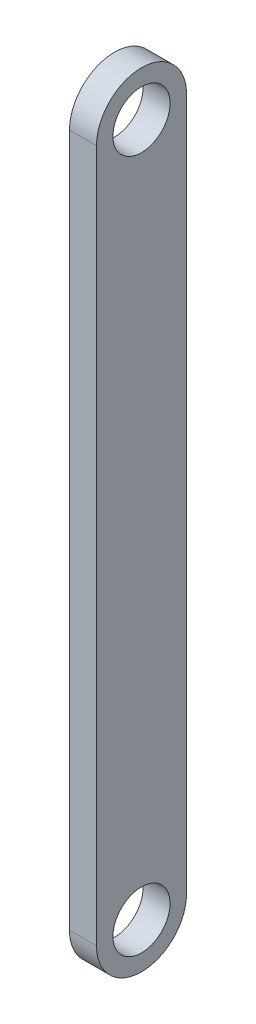
ISO-10303-21;
HEADER;
FILE_DESCRIPTION(('STEP AP214'),'2;1');
FILE_NAME('part.step','',(''),(''),'','','');
FILE_SCHEMA(('AUTOMOTIVE_DESIGN { 1 0 10303 214 1 1 1 1 }'));
ENDSEC;
DATA;
#1=APPLICATION_CONTEXT('core data for automotive mechanical design processes');
#2=APPLICATION_PROTOCOL_DEFINITION('international standard','automotive_design',2000,#1);
#3=PRODUCT_CONTEXT('',#1,'mechanical');
#4=PRODUCT('Part','Part','',(#3));
#5=PRODUCT_RELATED_PRODUCT_CATEGORY('part','',(#4));
#6=PRODUCT_DEFINITION_FORMATION('','',#4);
#7=PRODUCT_DEFINITION_CONTEXT('part definition',#1,'design');
#8=PRODUCT_DEFINITION('design','',#6,#7);
#9=PRODUCT_DEFINITION_SHAPE('','',#8);
#10=(LENGTH_UNIT() NAMED_UNIT(*) SI_UNIT(.MILLI.,.METRE.));
#11=(NAMED_UNIT(*) PLANE_ANGLE_UNIT() SI_UNIT($,.RADIAN.));
#12=(NAMED_UNIT(*) SI_UNIT($,.STERADIAN.) SOLID_ANGLE_UNIT());
#13=UNCERTAINTY_MEASURE_WITH_UNIT(LENGTH_MEASURE(1.E-05),#10,'distance_accuracy_value','');
#14=(GEOMETRIC_REPRESENTATION_CONTEXT(3) GLOBAL_UNCERTAINTY_ASSIGNED_CONTEXT((#13)) GLOBAL_UNIT_ASSIGNED_CONTEXT((#10,
#11,#12)) REPRESENTATION_CONTEXT('',''));
#15=CARTESIAN_POINT('',(0.,0.,0.));
#16=DIRECTION('',(0.,0.,1.));
#17=DIRECTION('',(1.,0.,0.));
#18=AXIS2_PLACEMENT_3D('',#15,#16,#17);
#19=CARTESIAN_POINT('',(3.,-38.5,0.));
#20=DIRECTION('',(-1.,0.,0.));
#21=DIRECTION('',(0.,0.,1.));
#22=AXIS2_PLACEMENT_3D('',#19,#20,#21);
#23=CYLINDRICAL_SURFACE('',#22,5.);
#24=DIRECTION('',(-1.,0.,0.));
#25=VECTOR('',#24,1.);
#26=CARTESIAN_POINT('',(3.,-38.5,-5.));
#27=LINE('',#26,#25);
#28=CARTESIAN_POINT('',(3.,-38.5,-5.));
#29=VERTEX_POINT('',#28);
#30=CARTESIAN_POINT('',(0.,-38.5,-5.));
#31=VERTEX_POINT('',#30);
#32=EDGE_CURVE('E90',#29,#31,#27,.T.);
#33=ORIENTED_EDGE('',*,*,#32,.F.);
#34=CARTESIAN_POINT('',(3.,-38.5,0.));
#35=DIRECTION('',(-1.,0.,0.));
#36=DIRECTION('',(0.,0.,1.));
#37=AXIS2_PLACEMENT_3D('',#34,#35,#36);
#38=CIRCLE('',#37,5.);
#39=CARTESIAN_POINT('',(3.,-38.5,5.));
#40=VERTEX_POINT('',#39);
#41=EDGE_CURVE('E44',#40,#29,#38,.F.);
#42=ORIENTED_EDGE('',*,*,#41,.F.);
#43=DIRECTION('',(1.,0.,0.));
#44=VECTOR('',#43,1.);
#45=CARTESIAN_POINT('',(3.,-38.5,5.));
#46=LINE('',#45,#44);
#47=CARTESIAN_POINT('',(0.,-38.5,5.));
#48=VERTEX_POINT('',#47);
#49=EDGE_CURVE('E107',#48,#40,#46,.T.);
#50=ORIENTED_EDGE('',*,*,#49,.F.);
#51=CARTESIAN_POINT('',(0.,-38.5,0.));
#52=DIRECTION('',(-1.,0.,0.));
#53=DIRECTION('',(0.,0.,1.));
#54=AXIS2_PLACEMENT_3D('',#51,#52,#53);
#55=CIRCLE('',#54,5.);
#56=EDGE_CURVE('E11',#31,#48,#55,.T.);
#57=ORIENTED_EDGE('',*,*,#56,.F.);
#58=EDGE_LOOP('',(#33,#42,#50,#57));
#59=FACE_BOUND('',#58,.T.);
#60=ADVANCED_FACE('F36',(#59),#23,.T.);
#61=CARTESIAN_POINT('',(3.,38.5,0.));
#62=DIRECTION('',(-1.,0.,0.));
#63=DIRECTION('',(0.,0.,1.));
#64=AXIS2_PLACEMENT_3D('',#61,#62,#63);
#65=CYLINDRICAL_SURFACE('',#64,5.);
#66=DIRECTION('',(-1.,0.,0.));
#67=VECTOR('',#66,1.);
#68=CARTESIAN_POINT('',(3.,38.5,5.));
#69=LINE('',#68,#67);
#70=CARTESIAN_POINT('',(3.,38.5,5.));
#71=VERTEX_POINT('',#70);
#72=CARTESIAN_POINT('',(0.,38.5,5.));
#73=VERTEX_POINT('',#72);
#74=EDGE_CURVE('E87',#71,#73,#69,.T.);
#75=ORIENTED_EDGE('',*,*,#74,.F.);
#76=CARTESIAN_POINT('',(3.,38.5,0.));
#77=DIRECTION('',(-1.,0.,0.));
#78=DIRECTION('',(0.,0.,1.));
#79=AXIS2_PLACEMENT_3D('',#76,#77,#78);
#80=CIRCLE('',#79,5.);
#81=CARTESIAN_POINT('',(3.,38.5,-5.));
#82=VERTEX_POINT('',#81);
#83=EDGE_CURVE('E91',#82,#71,#80,.F.);
#84=ORIENTED_EDGE('',*,*,#83,.F.);
#85=DIRECTION('',(1.,0.,0.));
#86=VECTOR('',#85,1.);
#87=CARTESIAN_POINT('',(3.,38.5,-5.));
#88=LINE('',#87,#86);
#89=CARTESIAN_POINT('',(0.,38.5,-5.));
#90=VERTEX_POINT('',#89);
#91=EDGE_CURVE('E89',#90,#82,#88,.T.);
#92=ORIENTED_EDGE('',*,*,#91,.F.);
#93=CARTESIAN_POINT('',(0.,38.5,0.));
#94=DIRECTION('',(-1.,0.,0.));
#95=DIRECTION('',(0.,0.,1.));
#96=AXIS2_PLACEMENT_3D('',#93,#94,#95);
#97=CIRCLE('',#96,5.);
#98=EDGE_CURVE('E76',#73,#90,#97,.T.);
#99=ORIENTED_EDGE('',*,*,#98,.F.);
#100=EDGE_LOOP('',(#75,#84,#92,#99));
#101=FACE_BOUND('',#100,.T.);
#102=ADVANCED_FACE('F85',(#101),#65,.T.);
#103=CARTESIAN_POINT('',(3.,-43.5,5.));
#104=DIRECTION('',(0.,0.,1.));
#105=DIRECTION('',(1.,0.,0.));
#106=AXIS2_PLACEMENT_3D('',#103,#104,#105);
#107=PLANE('',#106);
#108=DIRECTION('',(0.,1.,0.));
#109=VECTOR('',#108,1.);
#110=CARTESIAN_POINT('',(0.,-43.5,5.));
#111=LINE('',#110,#109);
#112=EDGE_CURVE('E73',#48,#73,#111,.T.);
#113=ORIENTED_EDGE('',*,*,#112,.F.);
#114=ORIENTED_EDGE('',*,*,#49,.T.);
#115=DIRECTION('',(0.,1.,0.));
#116=VECTOR('',#115,1.);
#117=CARTESIAN_POINT('',(3.,-43.5,5.));
#118=LINE('',#117,#116);
#119=EDGE_CURVE('E95',#40,#71,#118,.T.);
#120=ORIENTED_EDGE('',*,*,#119,.T.);
#121=ORIENTED_EDGE('',*,*,#74,.T.);
#122=EDGE_LOOP('',(#113,#114,#120,#121));
#123=FACE_BOUND('',#122,.T.);
#124=ADVANCED_FACE('F93',(#123),#107,.T.);
#125=CARTESIAN_POINT('',(3.,-43.5,-5.));
#126=DIRECTION('',(0.,0.,1.));
#127=DIRECTION('',(1.,0.,0.));
#128=AXIS2_PLACEMENT_3D('',#125,#126,#127);
#129=PLANE('',#128);
#130=DIRECTION('',(0.,1.,0.));
#131=VECTOR('',#130,1.);
#132=CARTESIAN_POINT('',(3.,-43.5,-5.));
#133=LINE('',#132,#131);
#134=EDGE_CURVE('E97',#29,#82,#133,.T.);
#135=ORIENTED_EDGE('',*,*,#134,.F.);
#136=ORIENTED_EDGE('',*,*,#32,.T.);
#137=DIRECTION('',(0.,1.,0.));
#138=VECTOR('',#137,1.);
#139=CARTESIAN_POINT('',(0.,-43.5,-5.));
#140=LINE('',#139,#138);
#141=EDGE_CURVE('E80',#31,#90,#140,.T.);
#142=ORIENTED_EDGE('',*,*,#141,.T.);
#143=ORIENTED_EDGE('',*,*,#91,.T.);
#144=EDGE_LOOP('',(#135,#136,#142,#143));
#145=FACE_BOUND('',#144,.T.);
#146=ADVANCED_FACE('F112',(#145),#129,.F.);
#147=CARTESIAN_POINT('',(3.,0.,0.));
#148=DIRECTION('',(-1.,0.,0.));
#149=DIRECTION('',(0.,0.,1.));
#150=AXIS2_PLACEMENT_3D('',#147,#148,#149);
#151=PLANE('',#150);
#152=CARTESIAN_POINT('',(3.,38.5,0.));
#153=DIRECTION('',(1.,0.,0.));
#154=DIRECTION('',(0.,0.,-1.));
#155=AXIS2_PLACEMENT_3D('',#152,#153,#154);
#156=CIRCLE('',#155,3.175);
#157=CARTESIAN_POINT('',(3.,38.5,-3.175));
#158=VERTEX_POINT('',#157);
#159=EDGE_CURVE('E117',#158,#158,#156,.T.);
#160=ORIENTED_EDGE('',*,*,#159,.F.);
#161=EDGE_LOOP('',(#160));
#162=FACE_BOUND('',#161,.T.);
#163=CARTESIAN_POINT('',(3.,-38.5,0.));
#164=DIRECTION('',(1.,0.,0.));
#165=DIRECTION('',(0.,0.,-1.));
#166=AXIS2_PLACEMENT_3D('',#163,#164,#165);
#167=CIRCLE('',#166,3.175);
#168=CARTESIAN_POINT('',(3.,-38.5,-3.175));
#169=VERTEX_POINT('',#168);
#170=EDGE_CURVE('E122',#169,#169,#167,.T.);
#171=ORIENTED_EDGE('',*,*,#170,.F.);
#172=EDGE_LOOP('',(#171));
#173=FACE_BOUND('',#172,.T.);
#174=ORIENTED_EDGE('',*,*,#119,.F.);
#175=ORIENTED_EDGE('',*,*,#41,.T.);
#176=ORIENTED_EDGE('',*,*,#134,.T.);
#177=ORIENTED_EDGE('',*,*,#83,.T.);
#178=EDGE_LOOP('',(#174,#175,#176,#177));
#179=FACE_BOUND('',#178,.T.);
#180=ADVANCED_FACE('F109',(#162,#173,#179),#151,.F.);
#181=CARTESIAN_POINT('',(0.,0.,0.));
#182=DIRECTION('',(-1.,0.,0.));
#183=DIRECTION('',(0.,0.,1.));
#184=AXIS2_PLACEMENT_3D('',#181,#182,#183);
#185=PLANE('',#184);
#186=CARTESIAN_POINT('',(0.,38.5,0.));
#187=DIRECTION('',(-1.,0.,0.));
#188=DIRECTION('',(0.,0.,1.));
#189=AXIS2_PLACEMENT_3D('',#186,#187,#188);
#190=CIRCLE('',#189,3.175);
#191=CARTESIAN_POINT('',(0.,38.5,3.175));
#192=VERTEX_POINT('',#191);
#193=EDGE_CURVE('E81',#192,#192,#190,.T.);
#194=ORIENTED_EDGE('',*,*,#193,.F.);
#195=EDGE_LOOP('',(#194));
#196=FACE_BOUND('',#195,.T.);
#197=CARTESIAN_POINT('',(0.,-38.5,0.));
#198=DIRECTION('',(-1.,0.,0.));
#199=DIRECTION('',(0.,0.,1.));
#200=AXIS2_PLACEMENT_3D('',#197,#198,#199);
#201=CIRCLE('',#200,3.175);
#202=CARTESIAN_POINT('',(0.,-38.5,3.17499999999999));
#203=VERTEX_POINT('',#202);
#204=EDGE_CURVE('E115',#203,#203,#201,.T.);
#205=ORIENTED_EDGE('',*,*,#204,.F.);
#206=EDGE_LOOP('',(#205));
#207=FACE_BOUND('',#206,.T.);
#208=ORIENTED_EDGE('',*,*,#141,.F.);
#209=ORIENTED_EDGE('',*,*,#56,.T.);
#210=ORIENTED_EDGE('',*,*,#112,.T.);
#211=ORIENTED_EDGE('',*,*,#98,.T.);
#212=EDGE_LOOP('',(#208,#209,#210,#211));
#213=FACE_BOUND('',#212,.T.);
#214=ADVANCED_FACE('F75',(#196,#207,#213),#185,.T.);
#215=CARTESIAN_POINT('',(-2.,-38.5,0.));
#216=DIRECTION('',(1.,0.,0.));
#217=DIRECTION('',(0.,0.,-1.));
#218=AXIS2_PLACEMENT_3D('',#215,#216,#217);
#219=CYLINDRICAL_SURFACE('',#218,3.175);
#220=ORIENTED_EDGE('',*,*,#204,.T.);
#221=EDGE_LOOP('',(#220));
#222=FACE_BOUND('',#221,.T.);
#223=ORIENTED_EDGE('',*,*,#170,.T.);
#224=EDGE_LOOP('',(#223));
#225=FACE_BOUND('',#224,.T.);
#226=ADVANCED_FACE('F130',(#222,#225),#219,.F.);
#227=CARTESIAN_POINT('',(-2.,38.5,0.));
#228=DIRECTION('',(1.,0.,0.));
#229=DIRECTION('',(0.,0.,-1.));
#230=AXIS2_PLACEMENT_3D('',#227,#228,#229);
#231=CYLINDRICAL_SURFACE('',#230,3.175);
#232=ORIENTED_EDGE('',*,*,#193,.T.);
#233=EDGE_LOOP('',(#232));
#234=FACE_BOUND('',#233,.T.);
#235=ORIENTED_EDGE('',*,*,#159,.T.);
#236=EDGE_LOOP('',(#235));
#237=FACE_BOUND('',#236,.T.);
#238=ADVANCED_FACE('F181',(#234,#237),#231,.F.);
#239=CLOSED_SHELL('',(#60,#102,#124,#146,#180,#214,#226,#238));
#240=MANIFOLD_SOLID_BREP('B2',#239);
#241=ADVANCED_BREP_SHAPE_REPRESENTATION('',(#18,#240),#14);
#242=SHAPE_DEFINITION_REPRESENTATION(#9,#241);
ENDSEC;
END-ISO-10303-21;
